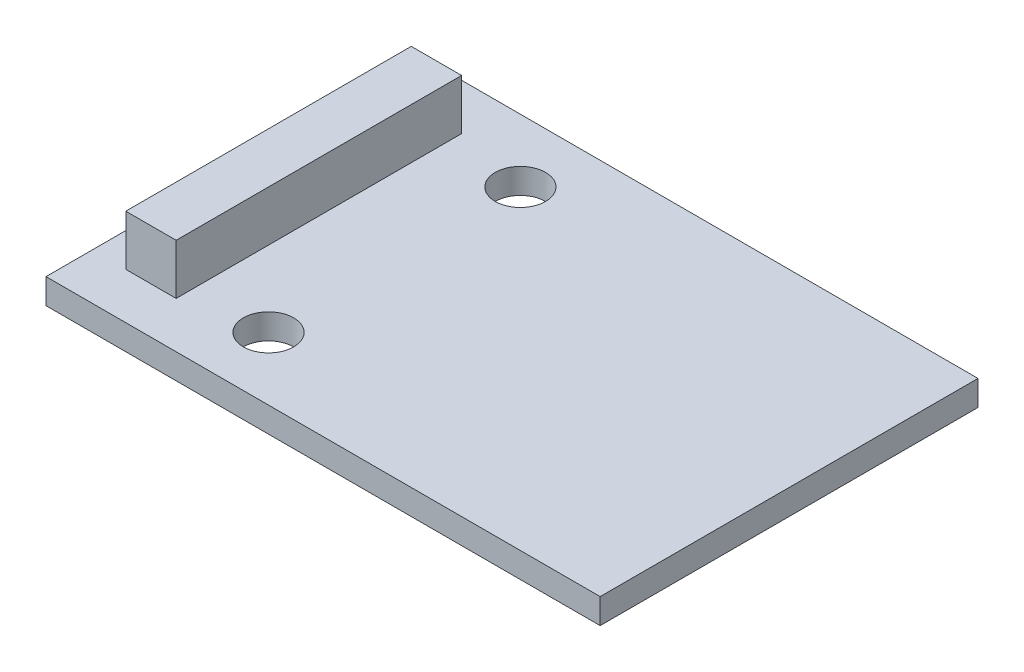
ISO-10303-21;
HEADER;
FILE_DESCRIPTION(('STEP AP214'),'2;1');
FILE_NAME('part.step','',(''),(''),'','','');
FILE_SCHEMA(('AUTOMOTIVE_DESIGN { 1 0 10303 214 1 1 1 1 }'));
ENDSEC;
DATA;
#1=APPLICATION_CONTEXT('core data for automotive mechanical design processes');
#2=APPLICATION_PROTOCOL_DEFINITION('international standard','automotive_design',2000,#1);
#3=PRODUCT_CONTEXT('',#1,'mechanical');
#4=PRODUCT('Part','Part','',(#3));
#5=PRODUCT_RELATED_PRODUCT_CATEGORY('part','',(#4));
#6=PRODUCT_DEFINITION_FORMATION('','',#4);
#7=PRODUCT_DEFINITION_CONTEXT('part definition',#1,'design');
#8=PRODUCT_DEFINITION('design','',#6,#7);
#9=PRODUCT_DEFINITION_SHAPE('','',#8);
#10=(LENGTH_UNIT() NAMED_UNIT(*) SI_UNIT(.MILLI.,.METRE.));
#11=(NAMED_UNIT(*) PLANE_ANGLE_UNIT() SI_UNIT($,.RADIAN.));
#12=(NAMED_UNIT(*) SI_UNIT($,.STERADIAN.) SOLID_ANGLE_UNIT());
#13=UNCERTAINTY_MEASURE_WITH_UNIT(LENGTH_MEASURE(1.E-05),#10,'distance_accuracy_value','');
#14=(GEOMETRIC_REPRESENTATION_CONTEXT(3) GLOBAL_UNCERTAINTY_ASSIGNED_CONTEXT((#13)) GLOBAL_UNIT_ASSIGNED_CONTEXT((#10,
#11,#12)) REPRESENTATION_CONTEXT('',''));
#15=CARTESIAN_POINT('',(0.,0.,0.));
#16=DIRECTION('',(0.,0.,1.));
#17=DIRECTION('',(1.,0.,0.));
#18=AXIS2_PLACEMENT_3D('',#15,#16,#17);
#19=CARTESIAN_POINT('',(0.,1.5,0.));
#20=DIRECTION('',(0.,-1.,0.));
#21=DIRECTION('',(0.,0.,-1.));
#22=AXIS2_PLACEMENT_3D('',#19,#20,#21);
#23=PLANE('',#22);
#24=CARTESIAN_POINT('',(-41.6158063227413,1.5,23.3064694273935));
#25=DIRECTION('',(0.,1.,0.));
#26=DIRECTION('',(0.,0.,1.));
#27=AXIS2_PLACEMENT_3D('',#24,#25,#26);
#28=CIRCLE('',#27,1.5);
#29=CARTESIAN_POINT('',(-41.6158063227413,1.5,24.8064694273935));
#30=VERTEX_POINT('',#29);
#31=EDGE_CURVE('E133',#30,#30,#28,.T.);
#32=ORIENTED_EDGE('',*,*,#31,.F.);
#33=EDGE_LOOP('',(#32));
#34=FACE_BOUND('',#33,.T.);
#35=CARTESIAN_POINT('',(-41.6158063227413,1.5,38.3064694273935));
#36=DIRECTION('',(0.,1.,0.));
#37=DIRECTION('',(0.,0.,1.));
#38=AXIS2_PLACEMENT_3D('',#35,#36,#37);
#39=CIRCLE('',#38,1.5);
#40=CARTESIAN_POINT('',(-41.6158063227413,1.5,39.8064694273935));
#41=VERTEX_POINT('',#40);
#42=EDGE_CURVE('E142',#41,#41,#39,.T.);
#43=ORIENTED_EDGE('',*,*,#42,.F.);
#44=EDGE_LOOP('',(#43));
#45=FACE_BOUND('',#44,.T.);
#46=DIRECTION('',(0.,0.,1.));
#47=VECTOR('',#46,1.);
#48=CARTESIAN_POINT('',(-51.1158063227413,1.5,42.0564694273935));
#49=LINE('',#48,#47);
#50=CARTESIAN_POINT('',(-51.1158063227413,1.5,19.5564694273935));
#51=VERTEX_POINT('',#50);
#52=CARTESIAN_POINT('',(-51.1158063227413,1.5,42.0564694273935));
#53=VERTEX_POINT('',#52);
#54=EDGE_CURVE('E148',#51,#53,#49,.T.);
#55=ORIENTED_EDGE('',*,*,#54,.T.);
#56=DIRECTION('',(1.,0.,0.));
#57=VECTOR('',#56,1.);
#58=CARTESIAN_POINT('',(-51.1158063227413,1.5,42.0564694273935));
#59=LINE('',#58,#57);
#60=CARTESIAN_POINT('',(-18.1158063227413,1.5,42.0564694273935));
#61=VERTEX_POINT('',#60);
#62=EDGE_CURVE('E151',#53,#61,#59,.T.);
#63=ORIENTED_EDGE('',*,*,#62,.T.);
#64=DIRECTION('',(0.,0.,-1.));
#65=VECTOR('',#64,1.);
#66=CARTESIAN_POINT('',(-18.1158063227413,1.5,42.0564694273935));
#67=LINE('',#66,#65);
#68=CARTESIAN_POINT('',(-18.1158063227413,1.5,19.5564694273935));
#69=VERTEX_POINT('',#68);
#70=EDGE_CURVE('E154',#61,#69,#67,.T.);
#71=ORIENTED_EDGE('',*,*,#70,.T.);
#72=DIRECTION('',(-1.,0.,0.));
#73=VECTOR('',#72,1.);
#74=CARTESIAN_POINT('',(-51.1158063227413,1.5,19.5564694273935));
#75=LINE('',#74,#73);
#76=EDGE_CURVE('E156',#69,#51,#75,.T.);
#77=ORIENTED_EDGE('',*,*,#76,.T.);
#78=EDGE_LOOP('',(#55,#63,#71,#77));
#79=FACE_BOUND('',#78,.T.);
#80=DIRECTION('',(0.,0.,-1.));
#81=VECTOR('',#80,1.);
#82=CARTESIAN_POINT('',(-46.1158063227413,1.5,39.3064694273935));
#83=LINE('',#82,#81);
#84=CARTESIAN_POINT('',(-46.1158063227413,1.5,39.3064694273935));
#85=VERTEX_POINT('',#84);
#86=CARTESIAN_POINT('',(-46.1158063227413,1.5,22.3064694273935));
#87=VERTEX_POINT('',#86);
#88=EDGE_CURVE('E129',#85,#87,#83,.T.);
#89=ORIENTED_EDGE('',*,*,#88,.F.);
#90=DIRECTION('',(1.,0.,0.));
#91=VECTOR('',#90,1.);
#92=CARTESIAN_POINT('',(-46.1158063227413,1.5,39.3064694273935));
#93=LINE('',#92,#91);
#94=CARTESIAN_POINT('',(-49.1158063227413,1.5,39.3064694273935));
#95=VERTEX_POINT('',#94);
#96=EDGE_CURVE('E126',#95,#85,#93,.T.);
#97=ORIENTED_EDGE('',*,*,#96,.F.);
#98=DIRECTION('',(0.,0.,1.));
#99=VECTOR('',#98,1.);
#100=CARTESIAN_POINT('',(-49.1158063227413,1.5,39.3064694273935));
#101=LINE('',#100,#99);
#102=CARTESIAN_POINT('',(-49.1158063227413,1.5,22.3064694273935));
#103=VERTEX_POINT('',#102);
#104=EDGE_CURVE('E64',#103,#95,#101,.T.);
#105=ORIENTED_EDGE('',*,*,#104,.F.);
#106=DIRECTION('',(-1.,0.,0.));
#107=VECTOR('',#106,1.);
#108=CARTESIAN_POINT('',(-46.1158063227413,1.5,22.3064694273935));
#109=LINE('',#108,#107);
#110=EDGE_CURVE('E59',#87,#103,#109,.T.);
#111=ORIENTED_EDGE('',*,*,#110,.F.);
#112=EDGE_LOOP('',(#89,#97,#105,#111));
#113=FACE_BOUND('',#112,.T.);
#114=ADVANCED_FACE('F44',(#34,#45,#79,#113),#23,.F.);
#115=CARTESIAN_POINT('',(0.,0.,0.));
#116=DIRECTION('',(0.,-1.,0.));
#117=DIRECTION('',(0.,0.,-1.));
#118=AXIS2_PLACEMENT_3D('',#115,#116,#117);
#119=PLANE('',#118);
#120=CARTESIAN_POINT('',(-41.6158063227413,0.,38.3064694273935));
#121=DIRECTION('',(0.,1.,0.));
#122=DIRECTION('',(0.,0.,1.));
#123=AXIS2_PLACEMENT_3D('',#120,#121,#122);
#124=CIRCLE('',#123,1.5);
#125=CARTESIAN_POINT('',(-41.6158063227413,0.,39.8064694273935));
#126=VERTEX_POINT('',#125);
#127=EDGE_CURVE('E140',#126,#126,#124,.T.);
#128=ORIENTED_EDGE('',*,*,#127,.T.);
#129=EDGE_LOOP('',(#128));
#130=FACE_BOUND('',#129,.T.);
#131=DIRECTION('',(0.,0.,1.));
#132=VECTOR('',#131,1.);
#133=CARTESIAN_POINT('',(-51.1158063227413,0.,42.0564694273935));
#134=LINE('',#133,#132);
#135=CARTESIAN_POINT('',(-51.1158063227413,0.,19.5564694273935));
#136=VERTEX_POINT('',#135);
#137=CARTESIAN_POINT('',(-51.1158063227413,0.,42.0564694273935));
#138=VERTEX_POINT('',#137);
#139=EDGE_CURVE('E145',#136,#138,#134,.T.);
#140=ORIENTED_EDGE('',*,*,#139,.F.);
#141=DIRECTION('',(-1.,0.,0.));
#142=VECTOR('',#141,1.);
#143=CARTESIAN_POINT('',(-51.1158063227413,0.,19.5564694273935));
#144=LINE('',#143,#142);
#145=CARTESIAN_POINT('',(-18.1158063227413,0.,19.5564694273935));
#146=VERTEX_POINT('',#145);
#147=EDGE_CURVE('E152',#146,#136,#144,.T.);
#148=ORIENTED_EDGE('',*,*,#147,.F.);
#149=DIRECTION('',(0.,0.,-1.));
#150=VECTOR('',#149,1.);
#151=CARTESIAN_POINT('',(-18.1158063227413,0.,42.0564694273935));
#152=LINE('',#151,#150);
#153=CARTESIAN_POINT('',(-18.1158063227413,0.,42.0564694273935));
#154=VERTEX_POINT('',#153);
#155=EDGE_CURVE('E163',#154,#146,#152,.T.);
#156=ORIENTED_EDGE('',*,*,#155,.F.);
#157=DIRECTION('',(1.,0.,0.));
#158=VECTOR('',#157,1.);
#159=CARTESIAN_POINT('',(-51.1158063227413,0.,42.0564694273935));
#160=LINE('',#159,#158);
#161=EDGE_CURVE('E161',#138,#154,#160,.T.);
#162=ORIENTED_EDGE('',*,*,#161,.F.);
#163=EDGE_LOOP('',(#140,#148,#156,#162));
#164=FACE_BOUND('',#163,.T.);
#165=CARTESIAN_POINT('',(-41.6158063227413,0.,23.3064694273935));
#166=DIRECTION('',(0.,1.,0.));
#167=DIRECTION('',(0.,0.,1.));
#168=AXIS2_PLACEMENT_3D('',#165,#166,#167);
#169=CIRCLE('',#168,1.5);
#170=CARTESIAN_POINT('',(-41.6158063227413,0.,24.8064694273935));
#171=VERTEX_POINT('',#170);
#172=EDGE_CURVE('E130',#171,#171,#169,.T.);
#173=ORIENTED_EDGE('',*,*,#172,.T.);
#174=EDGE_LOOP('',(#173));
#175=FACE_BOUND('',#174,.T.);
#176=ADVANCED_FACE('F181',(#130,#164,#175),#119,.T.);
#177=CARTESIAN_POINT('',(-51.1158063227413,1.5,42.0564694273935));
#178=DIRECTION('',(1.,0.,0.));
#179=DIRECTION('',(0.,0.,-1.));
#180=AXIS2_PLACEMENT_3D('',#177,#178,#179);
#181=PLANE('',#180);
#182=ORIENTED_EDGE('',*,*,#139,.T.);
#183=DIRECTION('',(0.,-1.,0.));
#184=VECTOR('',#183,1.);
#185=CARTESIAN_POINT('',(-51.1158063227413,1.5,42.0564694273935));
#186=LINE('',#185,#184);
#187=EDGE_CURVE('E13',#53,#138,#186,.T.);
#188=ORIENTED_EDGE('',*,*,#187,.F.);
#189=ORIENTED_EDGE('',*,*,#54,.F.);
#190=DIRECTION('',(0.,-1.,0.));
#191=VECTOR('',#190,1.);
#192=CARTESIAN_POINT('',(-51.1158063227413,1.5,19.5564694273935));
#193=LINE('',#192,#191);
#194=EDGE_CURVE('E158',#51,#136,#193,.T.);
#195=ORIENTED_EDGE('',*,*,#194,.T.);
#196=EDGE_LOOP('',(#182,#188,#189,#195));
#197=FACE_BOUND('',#196,.T.);
#198=ADVANCED_FACE('F46',(#197),#181,.F.);
#199=CARTESIAN_POINT('',(-51.1158063227413,1.5,42.0564694273935));
#200=DIRECTION('',(0.,0.,-1.));
#201=DIRECTION('',(-1.,0.,0.));
#202=AXIS2_PLACEMENT_3D('',#199,#200,#201);
#203=PLANE('',#202);
#204=ORIENTED_EDGE('',*,*,#161,.T.);
#205=DIRECTION('',(0.,-1.,0.));
#206=VECTOR('',#205,1.);
#207=CARTESIAN_POINT('',(-18.1158063227413,1.5,42.0564694273935));
#208=LINE('',#207,#206);
#209=EDGE_CURVE('E52',#61,#154,#208,.T.);
#210=ORIENTED_EDGE('',*,*,#209,.F.);
#211=ORIENTED_EDGE('',*,*,#62,.F.);
#212=ORIENTED_EDGE('',*,*,#187,.T.);
#213=EDGE_LOOP('',(#204,#210,#211,#212));
#214=FACE_BOUND('',#213,.T.);
#215=ADVANCED_FACE('F191',(#214),#203,.F.);
#216=CARTESIAN_POINT('',(-18.1158063227413,1.5,42.0564694273935));
#217=DIRECTION('',(-1.,0.,0.));
#218=DIRECTION('',(0.,0.,1.));
#219=AXIS2_PLACEMENT_3D('',#216,#217,#218);
#220=PLANE('',#219);
#221=ORIENTED_EDGE('',*,*,#155,.T.);
#222=DIRECTION('',(0.,-1.,0.));
#223=VECTOR('',#222,1.);
#224=CARTESIAN_POINT('',(-18.1158063227413,1.5,19.5564694273935));
#225=LINE('',#224,#223);
#226=EDGE_CURVE('E168',#69,#146,#225,.T.);
#227=ORIENTED_EDGE('',*,*,#226,.F.);
#228=ORIENTED_EDGE('',*,*,#70,.F.);
#229=ORIENTED_EDGE('',*,*,#209,.T.);
#230=EDGE_LOOP('',(#221,#227,#228,#229));
#231=FACE_BOUND('',#230,.T.);
#232=ADVANCED_FACE('F175',(#231),#220,.F.);
#233=CARTESIAN_POINT('',(-51.1158063227413,1.5,19.5564694273935));
#234=DIRECTION('',(0.,0.,1.));
#235=DIRECTION('',(1.,0.,0.));
#236=AXIS2_PLACEMENT_3D('',#233,#234,#235);
#237=PLANE('',#236);
#238=ORIENTED_EDGE('',*,*,#147,.T.);
#239=ORIENTED_EDGE('',*,*,#194,.F.);
#240=ORIENTED_EDGE('',*,*,#76,.F.);
#241=ORIENTED_EDGE('',*,*,#226,.T.);
#242=EDGE_LOOP('',(#238,#239,#240,#241));
#243=FACE_BOUND('',#242,.T.);
#244=ADVANCED_FACE('F185',(#243),#237,.F.);
#245=CARTESIAN_POINT('',(-41.6158063227413,1.5,38.3064694273935));
#246=DIRECTION('',(0.,-1.,0.));
#247=DIRECTION('',(0.,0.,-1.));
#248=AXIS2_PLACEMENT_3D('',#245,#246,#247);
#249=CYLINDRICAL_SURFACE('',#248,1.5);
#250=ORIENTED_EDGE('',*,*,#42,.T.);
#251=EDGE_LOOP('',(#250));
#252=FACE_BOUND('',#251,.T.);
#253=ORIENTED_EDGE('',*,*,#127,.F.);
#254=EDGE_LOOP('',(#253));
#255=FACE_BOUND('',#254,.T.);
#256=ADVANCED_FACE('F209',(#252,#255),#249,.F.);
#257=CARTESIAN_POINT('',(-41.6158063227413,1.5,23.3064694273935));
#258=DIRECTION('',(0.,-1.,0.));
#259=DIRECTION('',(0.,0.,-1.));
#260=AXIS2_PLACEMENT_3D('',#257,#258,#259);
#261=CYLINDRICAL_SURFACE('',#260,1.5);
#262=ORIENTED_EDGE('',*,*,#31,.T.);
#263=EDGE_LOOP('',(#262));
#264=FACE_BOUND('',#263,.T.);
#265=ORIENTED_EDGE('',*,*,#172,.F.);
#266=EDGE_LOOP('',(#265));
#267=FACE_BOUND('',#266,.T.);
#268=ADVANCED_FACE('F216',(#264,#267),#261,.F.);
#269=CARTESIAN_POINT('',(-46.1158063227413,4.5,39.3064694273935));
#270=DIRECTION('',(-1.,0.,0.));
#271=DIRECTION('',(0.,0.,1.));
#272=AXIS2_PLACEMENT_3D('',#269,#270,#271);
#273=PLANE('',#272);
#274=ORIENTED_EDGE('',*,*,#88,.T.);
#275=DIRECTION('',(0.,-1.,0.));
#276=VECTOR('',#275,1.);
#277=CARTESIAN_POINT('',(-46.1158063227413,4.5,22.3064694273935));
#278=LINE('',#277,#276);
#279=CARTESIAN_POINT('',(-46.1158063227413,4.5,22.3064694273935));
#280=VERTEX_POINT('',#279);
#281=EDGE_CURVE('E110',#280,#87,#278,.T.);
#282=ORIENTED_EDGE('',*,*,#281,.F.);
#283=DIRECTION('',(0.,0.,-1.));
#284=VECTOR('',#283,1.);
#285=CARTESIAN_POINT('',(-46.1158063227413,4.5,39.3064694273935));
#286=LINE('',#285,#284);
#287=CARTESIAN_POINT('',(-46.1158063227413,4.5,39.3064694273935));
#288=VERTEX_POINT('',#287);
#289=EDGE_CURVE('E117',#288,#280,#286,.T.);
#290=ORIENTED_EDGE('',*,*,#289,.F.);
#291=DIRECTION('',(0.,-1.,0.));
#292=VECTOR('',#291,1.);
#293=CARTESIAN_POINT('',(-46.1158063227413,4.5,39.3064694273935));
#294=LINE('',#293,#292);
#295=EDGE_CURVE('E286',#288,#85,#294,.T.);
#296=ORIENTED_EDGE('',*,*,#295,.T.);
#297=EDGE_LOOP('',(#274,#282,#290,#296));
#298=FACE_BOUND('',#297,.T.);
#299=ADVANCED_FACE('F128',(#298),#273,.F.);
#300=CARTESIAN_POINT('',(-46.1158063227413,4.5,22.3064694273935));
#301=DIRECTION('',(0.,0.,1.));
#302=DIRECTION('',(1.,0.,0.));
#303=AXIS2_PLACEMENT_3D('',#300,#301,#302);
#304=PLANE('',#303);
#305=ORIENTED_EDGE('',*,*,#110,.T.);
#306=DIRECTION('',(0.,-1.,0.));
#307=VECTOR('',#306,1.);
#308=CARTESIAN_POINT('',(-49.1158063227413,4.5,22.3064694273935));
#309=LINE('',#308,#307);
#310=CARTESIAN_POINT('',(-49.1158063227413,4.5,22.3064694273935));
#311=VERTEX_POINT('',#310);
#312=EDGE_CURVE('E113',#311,#103,#309,.T.);
#313=ORIENTED_EDGE('',*,*,#312,.F.);
#314=DIRECTION('',(-1.,0.,0.));
#315=VECTOR('',#314,1.);
#316=CARTESIAN_POINT('',(-46.1158063227413,4.5,22.3064694273935));
#317=LINE('',#316,#315);
#318=EDGE_CURVE('E106',#280,#311,#317,.T.);
#319=ORIENTED_EDGE('',*,*,#318,.F.);
#320=ORIENTED_EDGE('',*,*,#281,.T.);
#321=EDGE_LOOP('',(#305,#313,#319,#320));
#322=FACE_BOUND('',#321,.T.);
#323=ADVANCED_FACE('F108',(#322),#304,.F.);
#324=CARTESIAN_POINT('',(-49.1158063227413,4.5,39.3064694273935));
#325=DIRECTION('',(1.,0.,0.));
#326=DIRECTION('',(0.,0.,-1.));
#327=AXIS2_PLACEMENT_3D('',#324,#325,#326);
#328=PLANE('',#327);
#329=ORIENTED_EDGE('',*,*,#104,.T.);
#330=DIRECTION('',(0.,-1.,0.));
#331=VECTOR('',#330,1.);
#332=CARTESIAN_POINT('',(-49.1158063227413,4.5,39.3064694273935));
#333=LINE('',#332,#331);
#334=CARTESIAN_POINT('',(-49.1158063227413,4.5,39.3064694273935));
#335=VERTEX_POINT('',#334);
#336=EDGE_CURVE('E135',#335,#95,#333,.T.);
#337=ORIENTED_EDGE('',*,*,#336,.F.);
#338=DIRECTION('',(0.,0.,1.));
#339=VECTOR('',#338,1.);
#340=CARTESIAN_POINT('',(-49.1158063227413,4.5,39.3064694273935));
#341=LINE('',#340,#339);
#342=EDGE_CURVE('E116',#311,#335,#341,.T.);
#343=ORIENTED_EDGE('',*,*,#342,.F.);
#344=ORIENTED_EDGE('',*,*,#312,.T.);
#345=EDGE_LOOP('',(#329,#337,#343,#344));
#346=FACE_BOUND('',#345,.T.);
#347=ADVANCED_FACE('F233',(#346),#328,.F.);
#348=CARTESIAN_POINT('',(-46.1158063227413,4.5,39.3064694273935));
#349=DIRECTION('',(0.,0.,-1.));
#350=DIRECTION('',(-1.,0.,0.));
#351=AXIS2_PLACEMENT_3D('',#348,#349,#350);
#352=PLANE('',#351);
#353=ORIENTED_EDGE('',*,*,#96,.T.);
#354=ORIENTED_EDGE('',*,*,#295,.F.);
#355=DIRECTION('',(1.,0.,0.));
#356=VECTOR('',#355,1.);
#357=CARTESIAN_POINT('',(-46.1158063227413,4.5,39.3064694273935));
#358=LINE('',#357,#356);
#359=EDGE_CURVE('E122',#335,#288,#358,.T.);
#360=ORIENTED_EDGE('',*,*,#359,.F.);
#361=ORIENTED_EDGE('',*,*,#336,.T.);
#362=EDGE_LOOP('',(#353,#354,#360,#361));
#363=FACE_BOUND('',#362,.T.);
#364=ADVANCED_FACE('F236',(#363),#352,.F.);
#365=CARTESIAN_POINT('',(0.,4.5,0.));
#366=DIRECTION('',(0.,1.,0.));
#367=DIRECTION('',(0.,0.,1.));
#368=AXIS2_PLACEMENT_3D('',#365,#366,#367);
#369=PLANE('',#368);
#370=ORIENTED_EDGE('',*,*,#289,.T.);
#371=ORIENTED_EDGE('',*,*,#318,.T.);
#372=ORIENTED_EDGE('',*,*,#342,.T.);
#373=ORIENTED_EDGE('',*,*,#359,.T.);
#374=EDGE_LOOP('',(#370,#371,#372,#373));
#375=FACE_BOUND('',#374,.T.);
#376=ADVANCED_FACE('F120',(#375),#369,.T.);
#377=CLOSED_SHELL('',(#114,#176,#198,#215,#232,#244,#256,#268,#299,#323,#347,#364,#376));
#378=MANIFOLD_SOLID_BREP('B2',#377);
#379=ADVANCED_BREP_SHAPE_REPRESENTATION('',(#18,#378),#14);
#380=SHAPE_DEFINITION_REPRESENTATION(#9,#379);
ENDSEC;
END-ISO-10303-21;
